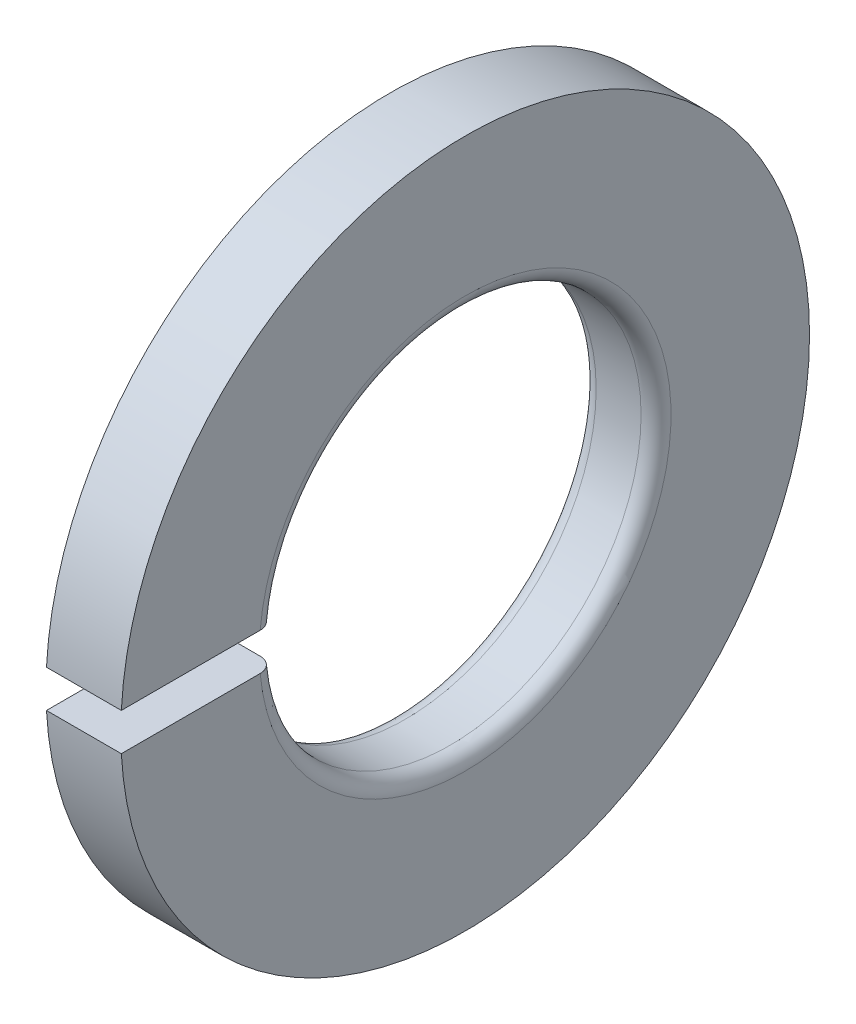
ISO-10303-21;
HEADER;
FILE_DESCRIPTION(('STEP AP214'),'2;1');
FILE_NAME('part.step','',(''),(''),'','','');
FILE_SCHEMA(('AUTOMOTIVE_DESIGN { 1 0 10303 214 1 1 1 1 }'));
ENDSEC;
DATA;
#1=APPLICATION_CONTEXT('core data for automotive mechanical design processes');
#2=APPLICATION_PROTOCOL_DEFINITION('international standard','automotive_design',2000,#1);
#3=PRODUCT_CONTEXT('',#1,'mechanical');
#4=PRODUCT('Part','Part','',(#3));
#5=PRODUCT_RELATED_PRODUCT_CATEGORY('part','',(#4));
#6=PRODUCT_DEFINITION_FORMATION('','',#4);
#7=PRODUCT_DEFINITION_CONTEXT('part definition',#1,'design');
#8=PRODUCT_DEFINITION('design','',#6,#7);
#9=PRODUCT_DEFINITION_SHAPE('','',#8);
#10=(LENGTH_UNIT() NAMED_UNIT(*) SI_UNIT(.MILLI.,.METRE.));
#11=(NAMED_UNIT(*) PLANE_ANGLE_UNIT() SI_UNIT($,.RADIAN.));
#12=(NAMED_UNIT(*) SI_UNIT($,.STERADIAN.) SOLID_ANGLE_UNIT());
#13=UNCERTAINTY_MEASURE_WITH_UNIT(LENGTH_MEASURE(1.E-05),#10,'distance_accuracy_value','');
#14=(GEOMETRIC_REPRESENTATION_CONTEXT(3) GLOBAL_UNCERTAINTY_ASSIGNED_CONTEXT((#13)) GLOBAL_UNIT_ASSIGNED_CONTEXT((#10,
#11,#12)) REPRESENTATION_CONTEXT('',''));
#15=CARTESIAN_POINT('',(0.,0.,0.));
#16=DIRECTION('',(0.,0.,1.));
#17=DIRECTION('',(1.,0.,0.));
#18=AXIS2_PLACEMENT_3D('',#15,#16,#17);
#19=CARTESIAN_POINT('',(-34.9249999999999,0.,0.));
#20=DIRECTION('',(-1.,0.,0.));
#21=DIRECTION('',(0.,0.,1.));
#22=AXIS2_PLACEMENT_3D('',#19,#20,#21);
#23=CYLINDRICAL_SURFACE('',#22,4.6);
#24=DIRECTION('',(-1.,0.,0.));
#25=VECTOR('',#24,1.);
#26=CARTESIAN_POINT('',(-34.9249999999999,0.25,4.59320149786617));
#27=LINE('',#26,#25);
#28=CARTESIAN_POINT('',(0.,0.25,4.59320149786617));
#29=VERTEX_POINT('',#28);
#30=CARTESIAN_POINT('',(-1.,0.25,4.59320149786617));
#31=VERTEX_POINT('',#30);
#32=EDGE_CURVE('E45',#29,#31,#27,.T.);
#33=ORIENTED_EDGE('',*,*,#32,.F.);
#34=CARTESIAN_POINT('',(0.,0.,0.));
#35=DIRECTION('',(-1.,0.,0.));
#36=DIRECTION('',(0.,0.,1.));
#37=AXIS2_PLACEMENT_3D('',#34,#35,#36);
#38=CIRCLE('',#37,4.6);
#39=CARTESIAN_POINT('',(0.,-0.25,4.59320149786617));
#40=VERTEX_POINT('',#39);
#41=EDGE_CURVE('E106',#29,#40,#38,.T.);
#42=ORIENTED_EDGE('',*,*,#41,.T.);
#43=DIRECTION('',(-1.,0.,0.));
#44=VECTOR('',#43,1.);
#45=CARTESIAN_POINT('',(-34.9249999999999,-0.25,4.59320149786617));
#46=LINE('',#45,#44);
#47=CARTESIAN_POINT('',(-1.,-0.25,4.59320149786617));
#48=VERTEX_POINT('',#47);
#49=EDGE_CURVE('E87',#48,#40,#46,.F.);
#50=ORIENTED_EDGE('',*,*,#49,.F.);
#51=CARTESIAN_POINT('',(-1.,0.,0.));
#52=DIRECTION('',(-1.,0.,0.));
#53=DIRECTION('',(0.,0.,1.));
#54=AXIS2_PLACEMENT_3D('',#51,#52,#53);
#55=CIRCLE('',#54,4.6);
#56=EDGE_CURVE('E118',#31,#48,#55,.T.);
#57=ORIENTED_EDGE('',*,*,#56,.F.);
#58=EDGE_LOOP('',(#33,#42,#50,#57));
#59=FACE_BOUND('',#58,.T.);
#60=ADVANCED_FACE('F32',(#59),#23,.T.);
#61=CARTESIAN_POINT('',(0.,2.75,0.));
#62=DIRECTION('',(-1.,0.,0.));
#63=DIRECTION('',(0.,0.,1.));
#64=AXIS2_PLACEMENT_3D('',#61,#62,#63);
#65=PLANE('',#64);
#66=DIRECTION('',(0.,0.,-1.));
#67=VECTOR('',#66,1.);
#68=CARTESIAN_POINT('',(0.,0.25,4.692));
#69=LINE('',#68,#67);
#70=CARTESIAN_POINT('',(0.,0.25,2.73861278752583));
#71=VERTEX_POINT('',#70);
#72=EDGE_CURVE('E92',#29,#71,#69,.T.);
#73=ORIENTED_EDGE('',*,*,#72,.T.);
#74=CARTESIAN_POINT('',(0.,0.,0.));
#75=DIRECTION('',(-1.,0.,0.));
#76=DIRECTION('',(0.,0.,1.));
#77=AXIS2_PLACEMENT_3D('',#74,#75,#76);
#78=CIRCLE('',#77,2.75);
#79=CARTESIAN_POINT('',(0.,-0.25,2.73861278752583));
#80=VERTEX_POINT('',#79);
#81=EDGE_CURVE('E99',#71,#80,#78,.T.);
#82=ORIENTED_EDGE('',*,*,#81,.T.);
#83=DIRECTION('',(0.,0.,1.));
#84=VECTOR('',#83,1.);
#85=CARTESIAN_POINT('',(0.,-0.25,0.));
#86=LINE('',#85,#84);
#87=EDGE_CURVE('E81',#80,#40,#86,.T.);
#88=ORIENTED_EDGE('',*,*,#87,.T.);
#89=ORIENTED_EDGE('',*,*,#41,.F.);
#90=EDGE_LOOP('',(#73,#82,#88,#89));
#91=FACE_BOUND('',#90,.T.);
#92=ADVANCED_FACE('F105',(#91),#65,.F.);
#93=CARTESIAN_POINT('',(-0.2,0.,0.));
#94=DIRECTION('',(-1.,0.,0.));
#95=DIRECTION('',(0.,0.,1.));
#96=AXIS2_PLACEMENT_3D('',#93,#94,#95);
#97=TOROIDAL_SURFACE('',#96,2.75,0.2);
#98=ORIENTED_EDGE('',*,*,#81,.F.);
#99=CARTESIAN_POINT('',(-0.124703331390481,0.25,2.55250165244662));
#100=CARTESIAN_POINT('',(-0.135060166522049,0.25,2.54827319929895));
#101=CARTESIAN_POINT('',(-0.145780939848211,0.25,2.54491499417204));
#102=CARTESIAN_POINT('',(-0.167642870486254,0.25,2.54004350762633));
#103=CARTESIAN_POINT('',(-0.178784502095985,0.25,2.53853237588934));
#104=CARTESIAN_POINT('',(-0.201159546087003,0.25,2.53740419335101));
#105=CARTESIAN_POINT('',(-0.21239291741027,0.25,2.53778633711411));
#106=CARTESIAN_POINT('',(-0.234632822680692,0.25,2.54043199288567));
#107=CARTESIAN_POINT('',(-0.245639410322881,0.25,2.54269505418398));
#108=CARTESIAN_POINT('',(-0.267114185255032,0.25,2.54903483294307));
#109=CARTESIAN_POINT('',(-0.277582504465689,0.25,2.55311110362982));
#110=CARTESIAN_POINT('',(-0.297689066247372,0.25,2.56295903624177));
#111=CARTESIAN_POINT('',(-0.307327269542029,0.25,2.56873077833011));
#112=CARTESIAN_POINT('',(-0.325527021843013,0.25,2.58182023179238));
#113=CARTESIAN_POINT('',(-0.334085746158871,0.25,2.58914187014652));
#114=CARTESIAN_POINT('',(-0.349859209087483,0.25,2.60511241039401));
#115=CARTESIAN_POINT('',(-0.357073919504262,0.25,2.61376134012559));
#116=CARTESIAN_POINT('',(-0.369988405429789,0.25,2.63218164140624));
#117=CARTESIAN_POINT('',(-0.375681374788824,0.25,2.64195778475939));
#118=CARTESIAN_POINT('',(-0.385352824715813,0.25,2.6623242080014));
#119=CARTESIAN_POINT('',(-0.389331268312332,0.25,2.6729145054406));
#120=CARTESIAN_POINT('',(-0.395476157597791,0.25,2.6946541631775));
#121=CARTESIAN_POINT('',(-0.397635305029905,0.25,2.70580558683659));
#122=CARTESIAN_POINT('',(-0.400054567113309,0.25,2.72831263628205));
#123=CARTESIAN_POINT('',(-0.400314654391274,0.25,2.73966826500951));
#124=CARTESIAN_POINT('',(-0.398926716275013,0.25,2.76228297235771));
#125=CARTESIAN_POINT('',(-0.39727525688979,0.25,2.77354184050074));
#126=CARTESIAN_POINT('',(-0.392103812711605,0.25,2.79562204486227));
#127=CARTESIAN_POINT('',(-0.388583831264216,0.25,2.80644338186414));
#128=CARTESIAN_POINT('',(-0.379777237300266,0.25,2.82732956000292));
#129=CARTESIAN_POINT('',(-0.37449231344638,0.25,2.83739511302681));
#130=CARTESIAN_POINT('',(-0.362302707870064,0.25,2.85649246031677));
#131=CARTESIAN_POINT('',(-0.355398048864557,0.25,2.86552426907853));
#132=CARTESIAN_POINT('',(-0.340186824242898,0.25,2.88226800196797));
#133=CARTESIAN_POINT('',(-0.331884569035293,0.25,2.88998384176044));
#134=CARTESIAN_POINT('',(-0.31409834227818,0.25,2.90390589510503));
#135=CARTESIAN_POINT('',(-0.304614394523798,0.25,2.91011213904768));
#136=CARTESIAN_POINT('',(-0.284771827282337,0.25,2.92081464489388));
#137=CARTESIAN_POINT('',(-0.274416583742087,0.25,2.92531716607067));
#138=CARTESIAN_POINT('',(-0.253095739730803,0.25,2.93251398942466));
#139=CARTESIAN_POINT('',(-0.242130150177403,0.25,2.93520832393475));
#140=CARTESIAN_POINT('',(-0.21993435996224,0.25,2.93870521694172));
#141=CARTESIAN_POINT('',(-0.208705027759509,0.25,2.93951328956381));
#142=CARTESIAN_POINT('',(-0.186270368804876,0.25,2.93923041962881));
#143=CARTESIAN_POINT('',(-0.175065041826454,0.25,2.93813949507105));
#144=CARTESIAN_POINT('',(-0.15300926095307,0.25,2.93409255617835));
#145=CARTESIAN_POINT('',(-0.142158430713801,0.25,2.93113859217424));
#146=CARTESIAN_POINT('',(-0.121105911444497,0.25,2.92345282553612));
#147=CARTESIAN_POINT('',(-0.110904224173184,0.25,2.91872101808563));
#148=CARTESIAN_POINT('',(-0.0914268522574672,0.25,2.90760960329285));
#149=CARTESIAN_POINT('',(-0.0821521959938052,0.25,2.90122819352658));
#150=CARTESIAN_POINT('',(-0.0648019284947681,0.25,2.88700307565207));
#151=CARTESIAN_POINT('',(-0.0567263318013646,0.25,2.87915934981175));
#152=CARTESIAN_POINT('',(-0.0419776982921522,0.25,2.86220830464014));
#153=CARTESIAN_POINT('',(-0.035308818083871,0.25,2.85309736898253));
#154=CARTESIAN_POINT('',(-0.0235886760548823,0.25,2.83388855855639));
#155=CARTESIAN_POINT('',(-0.0185374490731226,0.25,2.82379066253809));
#156=CARTESIAN_POINT('',(-0.0101763915549783,0.25,2.80285460069681));
#157=CARTESIAN_POINT('',(-0.00687306973663744,0.25,2.7920138354628));
#158=CARTESIAN_POINT('',(-0.00212713389161934,0.25,2.76993235022592));
#159=CARTESIAN_POINT('',(-0.000684558759457808,0.25,2.7586916218678));
#160=CARTESIAN_POINT('',(0.000302172997544306,0.25,2.73609252517541));
#161=CARTESIAN_POINT('',(-0.000159503302110629,0.25,2.72473390185415));
#162=CARTESIAN_POINT('',(-0.00298113491905114,0.25,2.70225527792617));
#163=CARTESIAN_POINT('',(-0.00534103553344942,0.25,2.69113527045252));
#164=CARTESIAN_POINT('',(-0.0118961587843927,0.25,2.66943902950564));
#165=CARTESIAN_POINT('',(-0.0160930306194817,0.25,2.65886329422692));
#166=CARTESIAN_POINT('',(-0.0262070422179857,0.25,2.6385654058151));
#167=CARTESIAN_POINT('',(-0.0321245997859165,0.25,2.62884346074056));
#168=CARTESIAN_POINT('',(-0.0455038997103438,0.25,2.61054786239317));
#169=CARTESIAN_POINT('',(-0.0529636641354679,0.25,2.60197276123003));
#170=CARTESIAN_POINT('',(-0.0692169803608327,0.25,2.5862113170605));
#171=CARTESIAN_POINT('',(-0.0780088862208107,0.25,2.57902328482703));
#172=CARTESIAN_POINT('',(-0.0931859412879718,0.25,2.56862616088362));
#173=CARTESIAN_POINT('',(-0.0992455294170801,0.25,2.56493301216437));
#174=CARTESIAN_POINT('',(-0.111722467193464,0.25,2.55821062320294));
#175=CARTESIAN_POINT('',(-0.118139816270338,0.25,2.55518138190228));
#176=CARTESIAN_POINT('',(-0.124703331390481,0.25,2.55250165244662));
#177=B_SPLINE_CURVE_WITH_KNOTS('',3,(#99,#100,#101,#102,#103,#104,#105,#106,#107,#108,#109,#110,
#111,#112,#113,#114,#115,#116,#117,#118,#119,#120,#121,#122,#123,#124,#125,#126,#127,#128,#129,
#130,#131,#132,#133,#134,#135,#136,#137,#138,#139,#140,#141,#142,#143,#144,#145,#146,#147,#148,
#149,#150,#151,#152,#153,#154,#155,#156,#157,#158,#159,#160,#161,#162,#163,#164,#165,#166,#167,
#168,#169,#170,#171,#172,#173,#174,#175,#176),.UNSPECIFIED.,.T.,.F.,(4,2,2,2,2,2,2,2,2,2,2,2,2,
2,2,2,2,2,2,2,2,2,2,2,2,2,2,2,2,2,2,2,2,2,2,2,2,2,4),(0.,0.0335344959497951,0.0671079833479678,
0.100667189170345,0.134218355770014,0.167761259951969,0.20130575032276,0.234936272192589,
0.268567499515393,0.30234672041718,0.336126669685838,0.370041493436978,0.403956806040294,
0.437933140366375,0.471909413858306,0.505853272202686,0.539796654510081,0.573637206224678,
0.607477076619874,0.641191387607345,0.674905095719867,0.70852012416717,0.742134834001901,
0.775712614238739,0.80929048544396,0.84290520145399,0.876520325103755,0.910233425831831,
0.943947252580761,0.977785752254138,1.01162495922999,1.04556789614781,1.07950985493564,
1.11348234888599,1.14746309869075,1.18140053445807,1.21529637537013,1.23654847790274,
1.25780054655275),.UNSPECIFIED.);
#178=CARTESIAN_POINT('',(-0.199999999999999,0.25,2.5377155080899));
#179=VERTEX_POINT('',#178);
#180=EDGE_CURVE('E125',#71,#179,#177,.T.);
#181=ORIENTED_EDGE('',*,*,#180,.T.);
#182=CARTESIAN_POINT('',(-0.199999999999999,0.,0.));
#183=DIRECTION('',(-1.,0.,0.));
#184=DIRECTION('',(0.,0.,1.));
#185=AXIS2_PLACEMENT_3D('',#182,#183,#184);
#186=CIRCLE('',#185,2.55);
#187=CARTESIAN_POINT('',(-0.199999999999999,-0.25,2.5377155080899));
#188=VERTEX_POINT('',#187);
#189=EDGE_CURVE('E101',#179,#188,#186,.T.);
#190=ORIENTED_EDGE('',*,*,#189,.T.);
#191=CARTESIAN_POINT('',(-0.124703331390481,-0.25,2.55250165244662));
#192=CARTESIAN_POINT('',(-0.114296286882057,-0.25,2.55675169499544));
#193=CARTESIAN_POINT('',(-0.104241601187659,-0.25,2.561886728607));
#194=CARTESIAN_POINT('',(-0.085130212974057,-0.25,2.57377848774841));
#195=CARTESIAN_POINT('',(-0.0760747712660385,-0.25,2.58053722862981));
#196=CARTESIAN_POINT('',(-0.059231275648471,-0.25,2.59547380997092));
#197=CARTESIAN_POINT('',(-0.0514423775027733,-0.25,2.60365069756549));
#198=CARTESIAN_POINT('',(-0.0373447126636527,-0.25,2.62118992916764));
#199=CARTESIAN_POINT('',(-0.0310355844410111,-0.25,2.63055198275956));
#200=CARTESIAN_POINT('',(-0.0200501779297241,-0.25,2.65023138936124));
#201=CARTESIAN_POINT('',(-0.0153795189501502,-0.25,2.66055187933595));
#202=CARTESIAN_POINT('',(-0.007830114564394,-0.25,2.68182914247933));
#203=CARTESIAN_POINT('',(-0.00495147743942179,-0.25,2.6927859540534));
#204=CARTESIAN_POINT('',(-0.00105936596380634,-0.25,2.71506507694182));
#205=CARTESIAN_POINT('',(-5.23596985510895E-05,-0.25,2.72638851866472));
#206=CARTESIAN_POINT('',(4.83739567167643E-05,-0.25,2.74904397027663));
#207=CARTESIAN_POINT('',(-0.000857912712209415,-0.25,2.76037598022799));
#208=CARTESIAN_POINT('',(-0.00456108941270724,-0.25,2.78273807388674));
#209=CARTESIAN_POINT('',(-0.00735979047205612,-0.25,2.79376785783533));
#210=CARTESIAN_POINT('',(-0.0147723225228599,-0.25,2.81519972125919));
#211=CARTESIAN_POINT('',(-0.0193861394747458,-0.25,2.82560180558888));
#212=CARTESIAN_POINT('',(-0.0302908183621082,-0.25,2.84546329986743));
#213=CARTESIAN_POINT('',(-0.0365788093783848,-0.25,2.85492428584283));
#214=CARTESIAN_POINT('',(-0.0506589760387405,-0.25,2.87265166635203));
#215=CARTESIAN_POINT('',(-0.0584511280651582,-0.25,2.88091807963891));
#216=CARTESIAN_POINT('',(-0.0752903139915674,-0.25,2.89599134589983));
#217=CARTESIAN_POINT('',(-0.0843329910874019,-0.25,2.9028030659571));
#218=CARTESIAN_POINT('',(-0.103436992526205,-0.25,2.9148051609888));
#219=CARTESIAN_POINT('',(-0.113498295800389,-0.25,2.9199955694886));
#220=CARTESIAN_POINT('',(-0.134314793097647,-0.25,2.92858840054976));
#221=CARTESIAN_POINT('',(-0.145067347364891,-0.25,2.93199721852524));
#222=CARTESIAN_POINT('',(-0.166992802637555,-0.25,2.93695628139886));
#223=CARTESIAN_POINT('',(-0.178165697031087,-0.25,2.93850655551903));
#224=CARTESIAN_POINT('',(-0.200585357674518,-0.25,2.93970199293296));
#225=CARTESIAN_POINT('',(-0.211831875558709,-0.25,2.9393518190795));
#226=CARTESIAN_POINT('',(-0.234106226744196,-0.25,2.93676736145251));
#227=CARTESIAN_POINT('',(-0.245134061355727,-0.25,2.93453308897099));
#228=CARTESIAN_POINT('',(-0.266653423777618,-0.25,2.928246514192));
#229=CARTESIAN_POINT('',(-0.277145182204734,-0.25,2.92419500112182));
#230=CARTESIAN_POINT('',(-0.297301224433929,-0.25,2.91439099434712));
#231=CARTESIAN_POINT('',(-0.306965503334836,-0.25,2.90863849056851));
#232=CARTESIAN_POINT('',(-0.32521084307559,-0.25,2.89558623951334));
#233=CARTESIAN_POINT('',(-0.333790007427188,-0.25,2.88828384148102));
#234=CARTESIAN_POINT('',(-0.349605555240917,-0.25,2.87234663878053));
#235=CARTESIAN_POINT('',(-0.356841917681355,-0.25,2.86371181325697));
#236=CARTESIAN_POINT('',(-0.369792225522695,-0.25,2.84532478193177));
#237=CARTESIAN_POINT('',(-0.375501085839358,-0.25,2.83556899476083));
#238=CARTESIAN_POINT('',(-0.385206820462217,-0.25,2.81524009391411));
#239=CARTESIAN_POINT('',(-0.389203659216393,-0.25,2.80466696327067));
#240=CARTESIAN_POINT('',(-0.395386841907209,-0.25,2.78296200198401));
#241=CARTESIAN_POINT('',(-0.397566502116355,-0.25,2.7718282671443));
#242=CARTESIAN_POINT('',(-0.400030956567876,-0.25,2.74935299643433));
#243=CARTESIAN_POINT('',(-0.400315720339028,-0.25,2.73801145722536));
#244=CARTESIAN_POINT('',(-0.398981350483665,-0.25,2.71541175319328));
#245=CARTESIAN_POINT('',(-0.397357353762672,-0.25,2.70415387519058));
#246=CARTESIAN_POINT('',(-0.392242858619064,-0.25,2.68207026447493));
#247=CARTESIAN_POINT('',(-0.388752345756828,-0.25,2.67124453510582));
#248=CARTESIAN_POINT('',(-0.380001204353079,-0.25,2.65033128166889));
#249=CARTESIAN_POINT('',(-0.374740240644212,-0.25,2.64024389781921));
#250=CARTESIAN_POINT('',(-0.362595331165928,-0.25,2.62109849405328));
#251=CARTESIAN_POINT('',(-0.355711398870576,-0.25,2.61204046559213));
#252=CARTESIAN_POINT('',(-0.340533453939577,-0.25,2.59523662609885));
#253=CARTESIAN_POINT('',(-0.332243060708722,-0.25,2.5874875462669));
#254=CARTESIAN_POINT('',(-0.314474363399889,-0.25,2.57349885991895));
#255=CARTESIAN_POINT('',(-0.304996133928238,-0.25,2.56725915867306));
#256=CARTESIAN_POINT('',(-0.285165775577252,-0.25,2.55649559689449));
#257=CARTESIAN_POINT('',(-0.274817731359153,-0.25,2.55196421037146));
#258=CARTESIAN_POINT('',(-0.253502826820231,-0.25,2.54471012677899));
#259=CARTESIAN_POINT('',(-0.242535827391977,-0.25,2.54198783806657));
#260=CARTESIAN_POINT('',(-0.220340939168088,-0.25,2.53843999527354));
#261=CARTESIAN_POINT('',(-0.20911413309748,-0.25,2.53760764054717));
#262=CARTESIAN_POINT('',(-0.186690133870316,-0.25,2.53784548731091));
#263=CARTESIAN_POINT('',(-0.175492921277811,-0.25,2.53891335265768));
#264=CARTESIAN_POINT('',(-0.157665346983442,-0.25,2.54214603077319));
#265=CARTESIAN_POINT('',(-0.150925390513896,-0.25,2.54373550294785));
#266=CARTESIAN_POINT('',(-0.137646910939073,-0.25,2.54760546208349));
#267=CARTESIAN_POINT('',(-0.13110838731609,-0.25,2.54988594726832));
#268=CARTESIAN_POINT('',(-0.124703331390481,-0.25,2.55250165244662));
#269=B_SPLINE_CURVE_WITH_KNOTS('',3,(#191,#192,#193,#194,#195,#196,#197,#198,#199,#200,#201,
#202,#203,#204,#205,#206,#207,#208,#209,#210,#211,#212,#213,#214,#215,#216,#217,#218,#219,#220,
#221,#222,#223,#224,#225,#226,#227,#228,#229,#230,#231,#232,#233,#234,#235,#236,#237,#238,#239,
#240,#241,#242,#243,#244,#245,#246,#247,#248,#249,#250,#251,#252,#253,#254,#255,#256,#257,#258,
#259,#260,#261,#262,#263,#264,#265,#266,#267,#268),.UNSPECIFIED.,.T.,.F.,(4,2,2,2,2,2,2,2,2,2,2,
2,2,2,2,2,2,2,2,2,2,2,2,2,2,2,2,2,2,2,2,2,2,2,2,2,2,2,4),(0.,0.033698853037711,
0.0674397513073309,0.101158065987531,0.134868134194163,0.168692709728409,0.202519328882018,
0.236462632121269,0.270406184777886,0.304382267245554,0.338358086919991,0.372276015053344,
0.406193410665918,0.439995483800732,0.473796857932149,0.507476046383533,0.541154705287541,
0.574750769179823,0.608346631721431,0.641927917691971,0.675509402551081,0.7091487908039,
0.742788705640131,0.776539253051983,0.810290501297265,0.844165348391066,0.878040740214112,
0.912002626373458,0.945964775270356,0.97993335722531,1.01390165717927,1.04778383307244,
1.08166388193923,1.11539287765536,1.14912948423574,1.18274450096871,1.21631821972173,
1.23705836289591,1.25779845276107),.UNSPECIFIED.);
#270=EDGE_CURVE('E84',#188,#80,#269,.T.);
#271=ORIENTED_EDGE('',*,*,#270,.T.);
#272=EDGE_LOOP('',(#98,#181,#190,#271));
#273=FACE_BOUND('',#272,.T.);
#274=ADVANCED_FACE('F97',(#273),#97,.T.);
#275=CARTESIAN_POINT('',(-34.9249999999999,0.,0.));
#276=DIRECTION('',(-1.,0.,0.));
#277=DIRECTION('',(0.,0.,1.));
#278=AXIS2_PLACEMENT_3D('',#275,#276,#277);
#279=CYLINDRICAL_SURFACE('',#278,2.55);
#280=DIRECTION('',(-1.,0.,0.));
#281=VECTOR('',#280,1.);
#282=CARTESIAN_POINT('',(-34.9249999999999,0.25,2.5377155080899));
#283=LINE('',#282,#281);
#284=CARTESIAN_POINT('',(-0.799999999990839,0.25,2.53771550803154));
#285=VERTEX_POINT('',#284);
#286=EDGE_CURVE('E133',#285,#179,#283,.F.);
#287=ORIENTED_EDGE('',*,*,#286,.F.);
#288=CARTESIAN_POINT('',(-0.800000000000002,0.,0.));
#289=DIRECTION('',(-1.,0.,0.));
#290=DIRECTION('',(0.,0.,1.));
#291=AXIS2_PLACEMENT_3D('',#288,#289,#290);
#292=CIRCLE('',#291,2.55);
#293=CARTESIAN_POINT('',(-0.800000000000002,-0.25,2.5377155080899));
#294=VERTEX_POINT('',#293);
#295=EDGE_CURVE('E109',#285,#294,#292,.T.);
#296=ORIENTED_EDGE('',*,*,#295,.T.);
#297=DIRECTION('',(-1.,0.,0.));
#298=VECTOR('',#297,1.);
#299=CARTESIAN_POINT('',(-34.9249999999999,-0.25,2.5377155080899));
#300=LINE('',#299,#298);
#301=EDGE_CURVE('E102',#188,#294,#300,.T.);
#302=ORIENTED_EDGE('',*,*,#301,.F.);
#303=ORIENTED_EDGE('',*,*,#189,.F.);
#304=EDGE_LOOP('',(#287,#296,#302,#303));
#305=FACE_BOUND('',#304,.T.);
#306=ADVANCED_FACE('F132',(#305),#279,.F.);
#307=CARTESIAN_POINT('',(-0.8,0.,0.));
#308=DIRECTION('',(-1.,0.,0.));
#309=DIRECTION('',(0.,0.,1.));
#310=AXIS2_PLACEMENT_3D('',#307,#308,#309);
#311=TOROIDAL_SURFACE('',#310,2.75,0.2);
#312=ORIENTED_EDGE('',*,*,#295,.F.);
#313=CARTESIAN_POINT('',(-0.875296668609519,0.25,2.55250165244662));
#314=CARTESIAN_POINT('',(-0.885703713117944,0.25,2.55675169499544));
#315=CARTESIAN_POINT('',(-0.895758398812342,0.25,2.561886728607));
#316=CARTESIAN_POINT('',(-0.914869787025944,0.25,2.57377848774842));
#317=CARTESIAN_POINT('',(-0.923925228733962,0.25,2.58053722862981));
#318=CARTESIAN_POINT('',(-0.940768724351529,0.25,2.59547380997092));
#319=CARTESIAN_POINT('',(-0.948557622497227,0.25,2.60365069756549));
#320=CARTESIAN_POINT('',(-0.962655287336348,0.25,2.62118992916764));
#321=CARTESIAN_POINT('',(-0.968964415558989,0.25,2.63055198275956));
#322=CARTESIAN_POINT('',(-0.979949822070276,0.25,2.65023138936124));
#323=CARTESIAN_POINT('',(-0.98462048104985,0.25,2.66055187933595));
#324=CARTESIAN_POINT('',(-0.992169885435606,0.25,2.68182914247933));
#325=CARTESIAN_POINT('',(-0.995048522560578,0.25,2.6927859540534));
#326=CARTESIAN_POINT('',(-0.998940634036193,0.25,2.71506507694183));
#327=CARTESIAN_POINT('',(-0.999947640301449,0.25,2.72638851866472));
#328=CARTESIAN_POINT('',(-1.00004837395672,0.25,2.74904397027663));
#329=CARTESIAN_POINT('',(-0.99914208728779,0.25,2.760375980228));
#330=CARTESIAN_POINT('',(-0.995438910587292,0.25,2.78273807388674));
#331=CARTESIAN_POINT('',(-0.992640209527943,0.25,2.79376785783533));
#332=CARTESIAN_POINT('',(-0.98522767747714,0.25,2.81519972125919));
#333=CARTESIAN_POINT('',(-0.980613860525253,0.25,2.82560180558888));
#334=CARTESIAN_POINT('',(-0.969709181637891,0.25,2.84546329986743));
#335=CARTESIAN_POINT('',(-0.963421190621614,0.25,2.85492428584283));
#336=CARTESIAN_POINT('',(-0.949341023961258,0.25,2.87265166635203));
#337=CARTESIAN_POINT('',(-0.94154887193484,0.25,2.88091807963891));
#338=CARTESIAN_POINT('',(-0.924709686008431,0.25,2.89599134589984));
#339=CARTESIAN_POINT('',(-0.915667008912596,0.25,2.9028030659571));
#340=CARTESIAN_POINT('',(-0.896563007473793,0.25,2.9148051609888));
#341=CARTESIAN_POINT('',(-0.886501704199609,0.25,2.9199955694886));
#342=CARTESIAN_POINT('',(-0.865685206902351,0.25,2.92858840054976));
#343=CARTESIAN_POINT('',(-0.854932652635108,0.25,2.93199721852524));
#344=CARTESIAN_POINT('',(-0.833007197362443,0.25,2.93695628139886));
#345=CARTESIAN_POINT('',(-0.821834302968911,0.25,2.93850655551903));
#346=CARTESIAN_POINT('',(-0.799414642325481,0.25,2.93970199293296));
#347=CARTESIAN_POINT('',(-0.78816812444129,0.25,2.9393518190795));
#348=CARTESIAN_POINT('',(-0.765893773255802,0.25,2.93676736145251));
#349=CARTESIAN_POINT('',(-0.754865938644271,0.25,2.93453308897099));
#350=CARTESIAN_POINT('',(-0.73334657622238,0.25,2.928246514192));
#351=CARTESIAN_POINT('',(-0.722854817795264,0.25,2.92419500112182));
#352=CARTESIAN_POINT('',(-0.70269877556607,0.25,2.91439099434712));
#353=CARTESIAN_POINT('',(-0.693034496665163,0.25,2.90863849056851));
#354=CARTESIAN_POINT('',(-0.674789156924409,0.25,2.89558623951334));
#355=CARTESIAN_POINT('',(-0.666209992572811,0.25,2.88828384148102));
#356=CARTESIAN_POINT('',(-0.650394444759082,0.25,2.87234663878053));
#357=CARTESIAN_POINT('',(-0.643158082318644,0.25,2.86371181325697));
#358=CARTESIAN_POINT('',(-0.630207774477304,0.25,2.84532478193176));
#359=CARTESIAN_POINT('',(-0.624498914160641,0.25,2.83556899476083));
#360=CARTESIAN_POINT('',(-0.614793179537783,0.25,2.81524009391411));
#361=CARTESIAN_POINT('',(-0.610796340783606,0.25,2.80466696327067));
#362=CARTESIAN_POINT('',(-0.60461315809279,0.25,2.78296200198401));
#363=CARTESIAN_POINT('',(-0.602433497883644,0.25,2.7718282671443));
#364=CARTESIAN_POINT('',(-0.599969043432124,0.25,2.74935299643432));
#365=CARTESIAN_POINT('',(-0.599684279660972,0.25,2.73801145722536));
#366=CARTESIAN_POINT('',(-0.601018649516334,0.25,2.71541175319328));
#367=CARTESIAN_POINT('',(-0.602642646237328,0.25,2.70415387519058));
#368=CARTESIAN_POINT('',(-0.607757141380936,0.25,2.68207026447492));
#369=CARTESIAN_POINT('',(-0.611247654243172,0.25,2.67124453510581));
#370=CARTESIAN_POINT('',(-0.619998795646921,0.25,2.65033128166889));
#371=CARTESIAN_POINT('',(-0.625259759355788,0.25,2.64024389781921));
#372=CARTESIAN_POINT('',(-0.637404668834072,0.25,2.62109849405328));
#373=CARTESIAN_POINT('',(-0.644288601129424,0.25,2.61204046559213));
#374=CARTESIAN_POINT('',(-0.659466546060423,0.25,2.59523662609885));
#375=CARTESIAN_POINT('',(-0.667756939291278,0.25,2.5874875462669));
#376=CARTESIAN_POINT('',(-0.685525636600111,0.25,2.57349885991895));
#377=CARTESIAN_POINT('',(-0.695003866071763,0.25,2.56725915867306));
#378=CARTESIAN_POINT('',(-0.714834224422749,0.25,2.55649559689449));
#379=CARTESIAN_POINT('',(-0.725182268640848,0.25,2.55196421037145));
#380=CARTESIAN_POINT('',(-0.74649717317977,0.25,2.54471012677899));
#381=CARTESIAN_POINT('',(-0.757464172608023,0.25,2.54198783806657));
#382=CARTESIAN_POINT('',(-0.779659060831913,0.25,2.53843999527354));
#383=CARTESIAN_POINT('',(-0.790885866902521,0.25,2.53760764054717));
#384=CARTESIAN_POINT('',(-0.813309866129685,0.25,2.53784548731092));
#385=CARTESIAN_POINT('',(-0.82450707872219,0.25,2.53891335265768));
#386=CARTESIAN_POINT('',(-0.842334653016559,0.25,2.54214603077319));
#387=CARTESIAN_POINT('',(-0.849074609486105,0.25,2.54373550294785));
#388=CARTESIAN_POINT('',(-0.862353089060928,0.25,2.54760546208349));
#389=CARTESIAN_POINT('',(-0.86889161268391,0.25,2.54988594726832));
#390=CARTESIAN_POINT('',(-0.875296668609519,0.25,2.55250165244662));
#391=B_SPLINE_CURVE_WITH_KNOTS('',3,(#313,#314,#315,#316,#317,#318,#319,#320,#321,#322,#323,
#324,#325,#326,#327,#328,#329,#330,#331,#332,#333,#334,#335,#336,#337,#338,#339,#340,#341,#342,
#343,#344,#345,#346,#347,#348,#349,#350,#351,#352,#353,#354,#355,#356,#357,#358,#359,#360,#361,
#362,#363,#364,#365,#366,#367,#368,#369,#370,#371,#372,#373,#374,#375,#376,#377,#378,#379,#380,
#381,#382,#383,#384,#385,#386,#387,#388,#389,#390),.UNSPECIFIED.,.T.,.F.,(4,2,2,2,2,2,2,2,2,2,2,
2,2,2,2,2,2,2,2,2,2,2,2,2,2,2,2,2,2,2,2,2,2,2,2,2,2,2,4),(0.,0.0336988530377113,
0.0674397513073312,0.101158065987531,0.134868134194163,0.168692709728409,0.202519328882019,
0.23646263212127,0.270406184777886,0.304382267245554,0.338358086919991,0.372276015053344,
0.406193410665919,0.439995483800733,0.473796857932149,0.507476046383533,0.541154705287541,
0.574750769179823,0.608346631721431,0.641927917691971,0.675509402551081,0.7091487908039,
0.742788705640131,0.776539253051983,0.810290501297265,0.844165348391066,0.878040740214111,
0.912002626373458,0.945964775270356,0.97993335722531,1.01390165717927,1.04778383307244,
1.08166388193923,1.11539287765535,1.14912948423574,1.18274450096871,1.21631821972173,
1.23705836289591,1.25779845276107),.UNSPECIFIED.);
#392=CARTESIAN_POINT('',(-1.,0.25,2.73861278752583));
#393=VERTEX_POINT('',#392);
#394=EDGE_CURVE('E119',#285,#393,#391,.T.);
#395=ORIENTED_EDGE('',*,*,#394,.T.);
#396=CARTESIAN_POINT('',(-1.,0.,0.));
#397=DIRECTION('',(-1.,0.,0.));
#398=DIRECTION('',(0.,0.,1.));
#399=AXIS2_PLACEMENT_3D('',#396,#397,#398);
#400=CIRCLE('',#399,2.75);
#401=CARTESIAN_POINT('',(-1.,-0.25,2.73861278752583));
#402=VERTEX_POINT('',#401);
#403=EDGE_CURVE('E122',#393,#402,#400,.T.);
#404=ORIENTED_EDGE('',*,*,#403,.T.);
#405=CARTESIAN_POINT('',(-0.875296668609519,-0.25,2.55250165244662));
#406=CARTESIAN_POINT('',(-0.864939833477952,-0.25,2.54827319929895));
#407=CARTESIAN_POINT('',(-0.85421906015179,-0.25,2.54491499417204));
#408=CARTESIAN_POINT('',(-0.832357129513747,-0.25,2.54004350762633));
#409=CARTESIAN_POINT('',(-0.821215497904016,-0.25,2.53853237588934));
#410=CARTESIAN_POINT('',(-0.798840453912998,-0.25,2.53740419335101));
#411=CARTESIAN_POINT('',(-0.787607082589731,-0.25,2.53778633711411));
#412=CARTESIAN_POINT('',(-0.765367177319309,-0.25,2.54043199288567));
#413=CARTESIAN_POINT('',(-0.75436058967712,-0.25,2.54269505418398));
#414=CARTESIAN_POINT('',(-0.732885814744969,-0.25,2.54903483294307));
#415=CARTESIAN_POINT('',(-0.722417495534312,-0.25,2.55311110362982));
#416=CARTESIAN_POINT('',(-0.702310933752629,-0.25,2.56295903624177));
#417=CARTESIAN_POINT('',(-0.692672730457972,-0.25,2.56873077833011));
#418=CARTESIAN_POINT('',(-0.674472978156988,-0.25,2.58182023179238));
#419=CARTESIAN_POINT('',(-0.66591425384113,-0.25,2.58914187014652));
#420=CARTESIAN_POINT('',(-0.650140790912517,-0.25,2.60511241039401));
#421=CARTESIAN_POINT('',(-0.642926080495739,-0.25,2.61376134012558));
#422=CARTESIAN_POINT('',(-0.630011594570211,-0.25,2.63218164140624));
#423=CARTESIAN_POINT('',(-0.624318625211176,-0.25,2.64195778475939));
#424=CARTESIAN_POINT('',(-0.614647175284188,-0.25,2.6623242080014));
#425=CARTESIAN_POINT('',(-0.610668731687668,-0.25,2.6729145054406));
#426=CARTESIAN_POINT('',(-0.604523842402209,-0.25,2.6946541631775));
#427=CARTESIAN_POINT('',(-0.602364694970095,-0.25,2.70580558683658));
#428=CARTESIAN_POINT('',(-0.599945432886691,-0.25,2.72831263628205));
#429=CARTESIAN_POINT('',(-0.599685345608726,-0.25,2.73966826500951));
#430=CARTESIAN_POINT('',(-0.601073283724986,-0.25,2.76228297235771));
#431=CARTESIAN_POINT('',(-0.602724743110209,-0.25,2.77354184050073));
#432=CARTESIAN_POINT('',(-0.607896187288394,-0.25,2.79562204486227));
#433=CARTESIAN_POINT('',(-0.611416168735783,-0.25,2.80644338186414));
#434=CARTESIAN_POINT('',(-0.620222762699733,-0.25,2.82732956000291));
#435=CARTESIAN_POINT('',(-0.625507686553619,-0.25,2.83739511302681));
#436=CARTESIAN_POINT('',(-0.637697292129935,-0.25,2.85649246031676));
#437=CARTESIAN_POINT('',(-0.644601951135442,-0.25,2.86552426907853));
#438=CARTESIAN_POINT('',(-0.659813175757101,-0.25,2.88226800196797));
#439=CARTESIAN_POINT('',(-0.668115430964705,-0.25,2.88998384176044));
#440=CARTESIAN_POINT('',(-0.685901657721818,-0.25,2.90390589510503));
#441=CARTESIAN_POINT('',(-0.695385605476201,-0.25,2.91011213904768));
#442=CARTESIAN_POINT('',(-0.715228172717661,-0.25,2.92081464489388));
#443=CARTESIAN_POINT('',(-0.725583416257911,-0.25,2.92531716607067));
#444=CARTESIAN_POINT('',(-0.746904260269195,-0.25,2.93251398942466));
#445=CARTESIAN_POINT('',(-0.757869849822595,-0.25,2.93520832393475));
#446=CARTESIAN_POINT('',(-0.780065640037758,-0.25,2.93870521694172));
#447=CARTESIAN_POINT('',(-0.791294972240489,-0.25,2.93951328956381));
#448=CARTESIAN_POINT('',(-0.813729631195122,-0.25,2.93923041962881));
#449=CARTESIAN_POINT('',(-0.824934958173544,-0.25,2.93813949507105));
#450=CARTESIAN_POINT('',(-0.846990739046928,-0.25,2.93409255617835));
#451=CARTESIAN_POINT('',(-0.857841569286197,-0.25,2.93113859217424));
#452=CARTESIAN_POINT('',(-0.878894088555501,-0.25,2.92345282553612));
#453=CARTESIAN_POINT('',(-0.889095775826814,-0.25,2.91872101808563));
#454=CARTESIAN_POINT('',(-0.908573147742531,-0.25,2.90760960329285));
#455=CARTESIAN_POINT('',(-0.917847804006193,-0.25,2.90122819352658));
#456=CARTESIAN_POINT('',(-0.935198071505231,-0.25,2.88700307565207));
#457=CARTESIAN_POINT('',(-0.943273668198634,-0.25,2.87915934981175));
#458=CARTESIAN_POINT('',(-0.958022301707847,-0.25,2.86220830464014));
#459=CARTESIAN_POINT('',(-0.964691181916128,-0.25,2.85309736898253));
#460=CARTESIAN_POINT('',(-0.976411323945117,-0.25,2.83388855855639));
#461=CARTESIAN_POINT('',(-0.981462550926876,-0.25,2.82379066253809));
#462=CARTESIAN_POINT('',(-0.989823608445021,-0.25,2.80285460069681));
#463=CARTESIAN_POINT('',(-0.993126930263362,-0.25,2.7920138354628));
#464=CARTESIAN_POINT('',(-0.99787286610838,-0.25,2.76993235022592));
#465=CARTESIAN_POINT('',(-0.999315441240542,-0.25,2.7586916218678));
#466=CARTESIAN_POINT('',(-1.00030217299754,-0.25,2.73609252517541));
#467=CARTESIAN_POINT('',(-0.999840496697889,-0.25,2.72473390185415));
#468=CARTESIAN_POINT('',(-0.997018865080949,-0.25,2.70225527792617));
#469=CARTESIAN_POINT('',(-0.994658964466551,-0.25,2.69113527045253));
#470=CARTESIAN_POINT('',(-0.988103841215608,-0.25,2.66943902950565));
#471=CARTESIAN_POINT('',(-0.983906969380519,-0.25,2.65886329422692));
#472=CARTESIAN_POINT('',(-0.973792957782015,-0.25,2.6385654058151));
#473=CARTESIAN_POINT('',(-0.967875400214084,-0.25,2.62884346074056));
#474=CARTESIAN_POINT('',(-0.954496100289657,-0.25,2.61054786239317));
#475=CARTESIAN_POINT('',(-0.947036335864533,-0.25,2.60197276123003));
#476=CARTESIAN_POINT('',(-0.930783019639168,-0.25,2.5862113170605));
#477=CARTESIAN_POINT('',(-0.92199111377919,-0.25,2.57902328482703));
#478=CARTESIAN_POINT('',(-0.906814058712029,-0.25,2.56862616088362));
#479=CARTESIAN_POINT('',(-0.900754470582921,-0.25,2.56493301216437));
#480=CARTESIAN_POINT('',(-0.888277532806537,-0.25,2.55821062320294));
#481=CARTESIAN_POINT('',(-0.881860183729662,-0.25,2.55518138190228));
#482=CARTESIAN_POINT('',(-0.875296668609519,-0.25,2.55250165244662));
#483=B_SPLINE_CURVE_WITH_KNOTS('',3,(#405,#406,#407,#408,#409,#410,#411,#412,#413,#414,#415,
#416,#417,#418,#419,#420,#421,#422,#423,#424,#425,#426,#427,#428,#429,#430,#431,#432,#433,#434,
#435,#436,#437,#438,#439,#440,#441,#442,#443,#444,#445,#446,#447,#448,#449,#450,#451,#452,#453,
#454,#455,#456,#457,#458,#459,#460,#461,#462,#463,#464,#465,#466,#467,#468,#469,#470,#471,#472,
#473,#474,#475,#476,#477,#478,#479,#480,#481,#482),.UNSPECIFIED.,.T.,.F.,(4,2,2,2,2,2,2,2,2,2,2,
2,2,2,2,2,2,2,2,2,2,2,2,2,2,2,2,2,2,2,2,2,2,2,2,2,2,2,4),(0.,0.0335344959497948,
0.0671079833479675,0.100667189170345,0.134218355770013,0.167761259951968,0.201305750322759,
0.234936272192588,0.268567499515392,0.302346720417179,0.336126669685838,0.370041493436977,
0.403956806040294,0.437933140366374,0.471909413858305,0.505853272202686,0.53979665451008,
0.573637206224677,0.607477076619873,0.641191387607344,0.674905095719867,0.70852012416717,
0.7421348340019,0.775712614238738,0.80929048544396,0.842905201453989,0.876520325103754,
0.910233425831831,0.943947252580761,0.977785752254137,1.01162495922999,1.04556789614781,
1.07950985493564,1.11348234888599,1.14746309869075,1.18140053445807,1.21529637537013,
1.23654847790274,1.25780054655274),.UNSPECIFIED.);
#484=EDGE_CURVE('E53',#402,#294,#483,.T.);
#485=ORIENTED_EDGE('',*,*,#484,.T.);
#486=EDGE_LOOP('',(#312,#395,#404,#485));
#487=FACE_BOUND('',#486,.T.);
#488=ADVANCED_FACE('F136',(#487),#311,.T.);
#489=CARTESIAN_POINT('',(-1.,4.6,0.));
#490=DIRECTION('',(1.,0.,0.));
#491=DIRECTION('',(0.,0.,-1.));
#492=AXIS2_PLACEMENT_3D('',#489,#490,#491);
#493=PLANE('',#492);
#494=DIRECTION('',(0.,0.,-1.));
#495=VECTOR('',#494,1.);
#496=CARTESIAN_POINT('',(-1.,0.25,0.));
#497=LINE('',#496,#495);
#498=EDGE_CURVE('E11',#31,#393,#497,.T.);
#499=ORIENTED_EDGE('',*,*,#498,.F.);
#500=ORIENTED_EDGE('',*,*,#56,.T.);
#501=DIRECTION('',(0.,0.,1.));
#502=VECTOR('',#501,1.);
#503=CARTESIAN_POINT('',(-1.,-0.25,0.));
#504=LINE('',#503,#502);
#505=EDGE_CURVE('E39',#402,#48,#504,.T.);
#506=ORIENTED_EDGE('',*,*,#505,.F.);
#507=ORIENTED_EDGE('',*,*,#403,.F.);
#508=EDGE_LOOP('',(#499,#500,#506,#507));
#509=FACE_BOUND('',#508,.T.);
#510=ADVANCED_FACE('F121',(#509),#493,.F.);
#511=CARTESIAN_POINT('',(-1.,-0.25,0.));
#512=DIRECTION('',(0.,1.,0.));
#513=DIRECTION('',(0.,0.,1.));
#514=AXIS2_PLACEMENT_3D('',#511,#512,#513);
#515=PLANE('',#514);
#516=ORIENTED_EDGE('',*,*,#49,.T.);
#517=ORIENTED_EDGE('',*,*,#87,.F.);
#518=ORIENTED_EDGE('',*,*,#270,.F.);
#519=ORIENTED_EDGE('',*,*,#301,.T.);
#520=ORIENTED_EDGE('',*,*,#484,.F.);
#521=ORIENTED_EDGE('',*,*,#505,.T.);
#522=EDGE_LOOP('',(#516,#517,#518,#519,#520,#521));
#523=FACE_BOUND('',#522,.T.);
#524=ADVANCED_FACE('F83',(#523),#515,.T.);
#525=CARTESIAN_POINT('',(-1.,0.25,4.692));
#526=DIRECTION('',(0.,-1.,0.));
#527=DIRECTION('',(0.,0.,-1.));
#528=AXIS2_PLACEMENT_3D('',#525,#526,#527);
#529=PLANE('',#528);
#530=ORIENTED_EDGE('',*,*,#32,.T.);
#531=ORIENTED_EDGE('',*,*,#498,.T.);
#532=ORIENTED_EDGE('',*,*,#394,.F.);
#533=ORIENTED_EDGE('',*,*,#286,.T.);
#534=ORIENTED_EDGE('',*,*,#180,.F.);
#535=ORIENTED_EDGE('',*,*,#72,.F.);
#536=EDGE_LOOP('',(#530,#531,#532,#533,#534,#535));
#537=FACE_BOUND('',#536,.T.);
#538=ADVANCED_FACE('F151',(#537),#529,.T.);
#539=CLOSED_SHELL('',(#60,#92,#274,#306,#488,#510,#524,#538));
#540=MANIFOLD_SOLID_BREP('B2',#539);
#541=ADVANCED_BREP_SHAPE_REPRESENTATION('',(#18,#540),#14);
#542=SHAPE_DEFINITION_REPRESENTATION(#9,#541);
ENDSEC;
END-ISO-10303-21;
